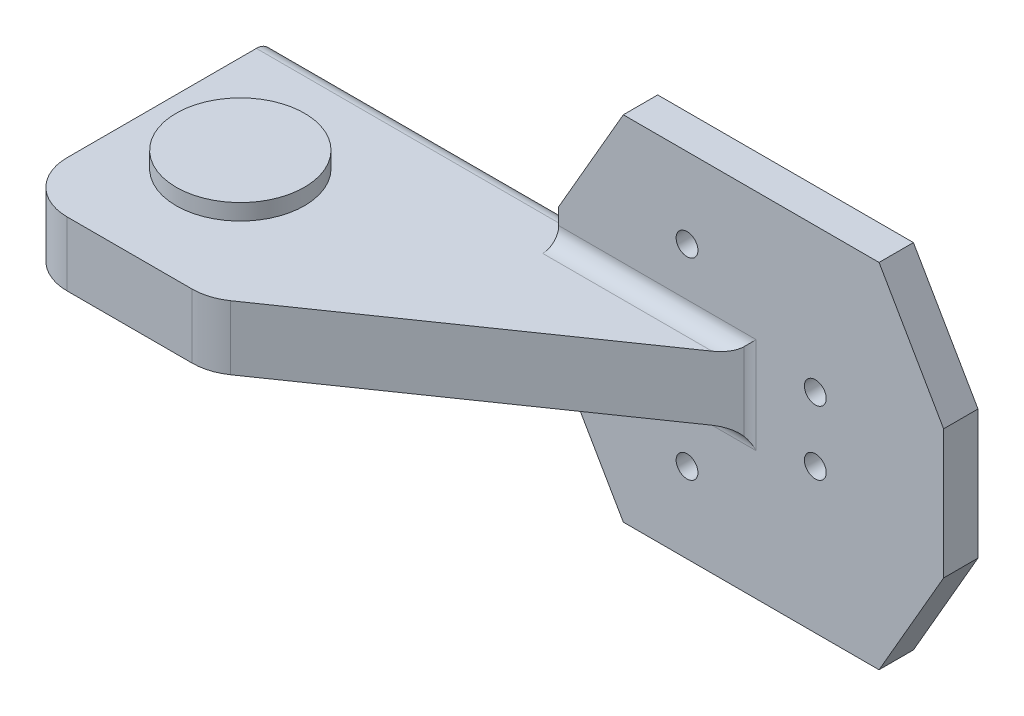
ISO-10303-21;
HEADER;
FILE_DESCRIPTION(('STEP AP214'),'2;1');
FILE_NAME('part.step','',(''),(''),'','','');
FILE_SCHEMA(('AUTOMOTIVE_DESIGN { 1 0 10303 214 1 1 1 1 }'));
ENDSEC;
DATA;
#1=APPLICATION_CONTEXT('core data for automotive mechanical design processes');
#2=APPLICATION_PROTOCOL_DEFINITION('international standard','automotive_design',2000,#1);
#3=PRODUCT_CONTEXT('',#1,'mechanical');
#4=PRODUCT('Part','Part','',(#3));
#5=PRODUCT_RELATED_PRODUCT_CATEGORY('part','',(#4));
#6=PRODUCT_DEFINITION_FORMATION('','',#4);
#7=PRODUCT_DEFINITION_CONTEXT('part definition',#1,'design');
#8=PRODUCT_DEFINITION('design','',#6,#7);
#9=PRODUCT_DEFINITION_SHAPE('','',#8);
#10=(LENGTH_UNIT() NAMED_UNIT(*) SI_UNIT(.MILLI.,.METRE.));
#11=(NAMED_UNIT(*) PLANE_ANGLE_UNIT() SI_UNIT($,.RADIAN.));
#12=(NAMED_UNIT(*) SI_UNIT($,.STERADIAN.) SOLID_ANGLE_UNIT());
#13=UNCERTAINTY_MEASURE_WITH_UNIT(LENGTH_MEASURE(1.E-05),#10,'distance_accuracy_value','');
#14=(GEOMETRIC_REPRESENTATION_CONTEXT(3) GLOBAL_UNCERTAINTY_ASSIGNED_CONTEXT((#13)) GLOBAL_UNIT_ASSIGNED_CONTEXT((#10,
#11,#12)) REPRESENTATION_CONTEXT('',''));
#15=CARTESIAN_POINT('',(0.,0.,0.));
#16=DIRECTION('',(0.,0.,1.));
#17=DIRECTION('',(1.,0.,0.));
#18=AXIS2_PLACEMENT_3D('',#15,#16,#17);
#19=CARTESIAN_POINT('',(0.,12.7,-25.4));
#20=DIRECTION('',(0.,0.,1.));
#21=DIRECTION('',(1.,0.,0.));
#22=AXIS2_PLACEMENT_3D('',#19,#20,#21);
#23=PLANE('',#22);
#24=CARTESIAN_POINT('',(114.3,12.7,-25.4));
#25=DIRECTION('',(0.,0.,-1.));
#26=DIRECTION('',(-1.,0.,0.));
#27=AXIS2_PLACEMENT_3D('',#24,#25,#26);
#28=CIRCLE('',#27,2.15899999999999);
#29=CARTESIAN_POINT('',(112.141,12.7,-25.4));
#30=VERTEX_POINT('',#29);
#31=EDGE_CURVE('E471',#30,#30,#28,.T.);
#32=ORIENTED_EDGE('',*,*,#31,.F.);
#33=EDGE_LOOP('',(#32));
#34=FACE_BOUND('',#33,.T.);
#35=DIRECTION('',(0.,-1.,0.));
#36=VECTOR('',#35,1.);
#37=CARTESIAN_POINT('',(63.5,19.1334372271715,-25.4));
#38=LINE('',#37,#36);
#39=CARTESIAN_POINT('',(63.5,3.175,-25.4));
#40=VERTEX_POINT('',#39);
#41=CARTESIAN_POINT('',(63.5,-6.43343722717151,-25.4));
#42=VERTEX_POINT('',#41);
#43=EDGE_CURVE('E332',#40,#42,#38,.T.);
#44=ORIENTED_EDGE('',*,*,#43,.F.);
#45=DIRECTION('',(-1.,0.,0.));
#46=VECTOR('',#45,1.);
#47=CARTESIAN_POINT('',(0.,3.175,-25.4));
#48=LINE('',#47,#46);
#49=CARTESIAN_POINT('',(0.,3.175,-25.4));
#50=VERTEX_POINT('',#49);
#51=EDGE_CURVE('E267',#40,#50,#48,.T.);
#52=ORIENTED_EDGE('',*,*,#51,.T.);
#53=DIRECTION('',(0.,-1.,0.));
#54=VECTOR('',#53,1.);
#55=CARTESIAN_POINT('',(0.,12.7,-25.4));
#56=LINE('',#55,#54);
#57=CARTESIAN_POINT('',(0.,9.525,-25.4));
#58=VERTEX_POINT('',#57);
#59=EDGE_CURVE('E227',#58,#50,#56,.T.);
#60=ORIENTED_EDGE('',*,*,#59,.F.);
#61=DIRECTION('',(-1.,0.,0.));
#62=VECTOR('',#61,1.);
#63=CARTESIAN_POINT('',(63.5,9.525,-25.4));
#64=LINE('',#63,#62);
#65=CARTESIAN_POINT('',(63.5,9.525,-25.4));
#66=VERTEX_POINT('',#65);
#67=EDGE_CURVE('E264',#58,#66,#64,.F.);
#68=ORIENTED_EDGE('',*,*,#67,.T.);
#69=CARTESIAN_POINT('',(63.5,19.1334372271715,-25.4));
#70=VERTEX_POINT('',#69);
#71=EDGE_CURVE('E336',#70,#66,#38,.T.);
#72=ORIENTED_EDGE('',*,*,#71,.F.);
#73=DIRECTION('',(0.499999999999997,0.86602540378444,0.));
#74=VECTOR('',#73,1.);
#75=CARTESIAN_POINT('',(63.5,19.1334372271715,-25.4));
#76=LINE('',#75,#74);
#77=CARTESIAN_POINT('',(76.2834372271714,41.275,-25.4));
#78=VERTEX_POINT('',#77);
#79=EDGE_CURVE('E337',#70,#78,#76,.T.);
#80=ORIENTED_EDGE('',*,*,#79,.T.);
#81=DIRECTION('',(1.,0.,0.));
#82=VECTOR('',#81,1.);
#83=CARTESIAN_POINT('',(76.2834372271714,41.275,-25.4));
#84=LINE('',#83,#82);
#85=CARTESIAN_POINT('',(126.916562772829,41.275,-25.4));
#86=VERTEX_POINT('',#85);
#87=EDGE_CURVE('E432',#78,#86,#84,.T.);
#88=ORIENTED_EDGE('',*,*,#87,.T.);
#89=DIRECTION('',(0.499999999999997,-0.86602540378444,0.));
#90=VECTOR('',#89,1.);
#91=CARTESIAN_POINT('',(126.916562772829,41.275,-25.4));
#92=LINE('',#91,#90);
#93=CARTESIAN_POINT('',(139.7,19.1334372271715,-25.4));
#94=VERTEX_POINT('',#93);
#95=EDGE_CURVE('E429',#86,#94,#92,.T.);
#96=ORIENTED_EDGE('',*,*,#95,.T.);
#97=DIRECTION('',(0.,1.,0.));
#98=VECTOR('',#97,1.);
#99=CARTESIAN_POINT('',(139.7,-6.43343722717151,-25.4));
#100=LINE('',#99,#98);
#101=CARTESIAN_POINT('',(139.7,-6.43343722717151,-25.4));
#102=VERTEX_POINT('',#101);
#103=EDGE_CURVE('E426',#102,#94,#100,.T.);
#104=ORIENTED_EDGE('',*,*,#103,.F.);
#105=DIRECTION('',(0.499999999999997,0.86602540378444,0.));
#106=VECTOR('',#105,1.);
#107=CARTESIAN_POINT('',(126.916562772829,-28.575,-25.4));
#108=LINE('',#107,#106);
#109=CARTESIAN_POINT('',(126.916562772829,-28.575,-25.4));
#110=VERTEX_POINT('',#109);
#111=EDGE_CURVE('E424',#110,#102,#108,.T.);
#112=ORIENTED_EDGE('',*,*,#111,.F.);
#113=DIRECTION('',(1.,0.,0.));
#114=VECTOR('',#113,1.);
#115=CARTESIAN_POINT('',(76.2834372271714,-28.575,-25.4));
#116=LINE('',#115,#114);
#117=CARTESIAN_POINT('',(76.2834372271714,-28.575,-25.4));
#118=VERTEX_POINT('',#117);
#119=EDGE_CURVE('E210',#118,#110,#116,.T.);
#120=ORIENTED_EDGE('',*,*,#119,.F.);
#121=DIRECTION('',(0.499999999999997,-0.86602540378444,0.));
#122=VECTOR('',#121,1.);
#123=CARTESIAN_POINT('',(63.5,-6.43343722717151,-25.4));
#124=LINE('',#123,#122);
#125=EDGE_CURVE('E206',#42,#118,#124,.T.);
#126=ORIENTED_EDGE('',*,*,#125,.F.);
#127=EDGE_LOOP('',(#44,#52,#60,#68,#72,#80,#88,#96,#104,#112,#120,#126));
#128=FACE_BOUND('',#127,.T.);
#129=CARTESIAN_POINT('',(88.9,-12.7,-25.4));
#130=DIRECTION('',(0.,0.,-1.));
#131=DIRECTION('',(-1.,0.,0.));
#132=AXIS2_PLACEMENT_3D('',#129,#130,#131);
#133=CIRCLE('',#132,2.15899999999999);
#134=CARTESIAN_POINT('',(86.741,-12.7,-25.4));
#135=VERTEX_POINT('',#134);
#136=EDGE_CURVE('E465',#135,#135,#133,.F.);
#137=ORIENTED_EDGE('',*,*,#136,.T.);
#138=EDGE_LOOP('',(#137));
#139=FACE_BOUND('',#138,.T.);
#140=CARTESIAN_POINT('',(88.9,25.4,-25.4));
#141=DIRECTION('',(0.,0.,-1.));
#142=DIRECTION('',(-1.,0.,0.));
#143=AXIS2_PLACEMENT_3D('',#140,#141,#142);
#144=CIRCLE('',#143,2.15899999999999);
#145=CARTESIAN_POINT('',(86.741,25.4,-25.4));
#146=VERTEX_POINT('',#145);
#147=EDGE_CURVE('E243',#146,#146,#144,.T.);
#148=ORIENTED_EDGE('',*,*,#147,.F.);
#149=EDGE_LOOP('',(#148));
#150=FACE_BOUND('',#149,.T.);
#151=CARTESIAN_POINT('',(114.3,0.,-25.4));
#152=DIRECTION('',(0.,0.,-1.));
#153=DIRECTION('',(-1.,0.,0.));
#154=AXIS2_PLACEMENT_3D('',#151,#152,#153);
#155=CIRCLE('',#154,2.15899999999999);
#156=CARTESIAN_POINT('',(112.141,0.,-25.4));
#157=VERTEX_POINT('',#156);
#158=EDGE_CURVE('E474',#157,#157,#155,.F.);
#159=ORIENTED_EDGE('',*,*,#158,.T.);
#160=EDGE_LOOP('',(#159));
#161=FACE_BOUND('',#160,.T.);
#162=ADVANCED_FACE('F39',(#34,#128,#139,#150,#161),#23,.F.);
#163=CARTESIAN_POINT('',(0.,0.,-18.5940905122489));
#164=DIRECTION('',(0.,0.,1.));
#165=DIRECTION('',(1.,0.,0.));
#166=AXIS2_PLACEMENT_3D('',#163,#164,#165);
#167=PLANE('',#166);
#168=CARTESIAN_POINT('',(88.9,25.4,-18.5940905122489));
#169=DIRECTION('',(0.,0.,1.));
#170=DIRECTION('',(1.,0.,0.));
#171=AXIS2_PLACEMENT_3D('',#168,#169,#170);
#172=CIRCLE('',#171,2.15899999999999);
#173=CARTESIAN_POINT('',(91.059,25.4,-18.5940905122489));
#174=VERTEX_POINT('',#173);
#175=EDGE_CURVE('E242',#174,#174,#172,.T.);
#176=ORIENTED_EDGE('',*,*,#175,.F.);
#177=EDGE_LOOP('',(#176));
#178=FACE_BOUND('',#177,.T.);
#179=DIRECTION('',(0.,-1.,0.));
#180=VECTOR('',#179,1.);
#181=CARTESIAN_POINT('',(102.592399015859,0.,-18.5940905122489));
#182=LINE('',#181,#180);
#183=CARTESIAN_POINT('',(102.592399015859,15.875,-18.5940905122489));
#184=VERTEX_POINT('',#183);
#185=CARTESIAN_POINT('',(102.592399015859,-3.175,-18.5940905122489));
#186=VERTEX_POINT('',#185);
#187=EDGE_CURVE('E252',#184,#186,#182,.T.);
#188=ORIENTED_EDGE('',*,*,#187,.T.);
#189=DIRECTION('',(1.,0.,0.));
#190=VECTOR('',#189,1.);
#191=CARTESIAN_POINT('',(0.,-3.175,-18.5940905122489));
#192=LINE('',#191,#190);
#193=CARTESIAN_POINT('',(63.5,-3.175,-18.5940905122489));
#194=VERTEX_POINT('',#193);
#195=EDGE_CURVE('E254',#186,#194,#192,.F.);
#196=ORIENTED_EDGE('',*,*,#195,.T.);
#197=DIRECTION('',(0.,-1.,0.));
#198=VECTOR('',#197,1.);
#199=CARTESIAN_POINT('',(63.5,19.1334372271715,-18.5940905122489));
#200=LINE('',#199,#198);
#201=CARTESIAN_POINT('',(63.5,-6.43343722717151,-18.5940905122489));
#202=VERTEX_POINT('',#201);
#203=EDGE_CURVE('E416',#194,#202,#200,.T.);
#204=ORIENTED_EDGE('',*,*,#203,.T.);
#205=DIRECTION('',(0.499999999999997,-0.86602540378444,0.));
#206=VECTOR('',#205,1.);
#207=CARTESIAN_POINT('',(63.5,-6.43343722717151,-18.5940905122489));
#208=LINE('',#207,#206);
#209=CARTESIAN_POINT('',(76.2834372271714,-28.575,-18.5940905122489));
#210=VERTEX_POINT('',#209);
#211=EDGE_CURVE('E202',#202,#210,#208,.T.);
#212=ORIENTED_EDGE('',*,*,#211,.T.);
#213=DIRECTION('',(1.,0.,0.));
#214=VECTOR('',#213,1.);
#215=CARTESIAN_POINT('',(76.2834372271714,-28.575,-18.5940905122489));
#216=LINE('',#215,#214);
#217=CARTESIAN_POINT('',(126.916562772829,-28.575,-18.5940905122489));
#218=VERTEX_POINT('',#217);
#219=EDGE_CURVE('E196',#210,#218,#216,.T.);
#220=ORIENTED_EDGE('',*,*,#219,.T.);
#221=DIRECTION('',(0.499999999999997,0.86602540378444,0.));
#222=VECTOR('',#221,1.);
#223=CARTESIAN_POINT('',(126.916562772829,-28.575,-18.5940905122489));
#224=LINE('',#223,#222);
#225=CARTESIAN_POINT('',(139.7,-6.43343722717151,-18.5940905122489));
#226=VERTEX_POINT('',#225);
#227=EDGE_CURVE('E185',#218,#226,#224,.T.);
#228=ORIENTED_EDGE('',*,*,#227,.T.);
#229=DIRECTION('',(0.,1.,0.));
#230=VECTOR('',#229,1.);
#231=CARTESIAN_POINT('',(139.7,-6.43343722717151,-18.5940905122489));
#232=LINE('',#231,#230);
#233=CARTESIAN_POINT('',(139.7,19.1334372271715,-18.5940905122489));
#234=VERTEX_POINT('',#233);
#235=EDGE_CURVE('E195',#226,#234,#232,.T.);
#236=ORIENTED_EDGE('',*,*,#235,.T.);
#237=DIRECTION('',(0.499999999999997,-0.86602540378444,0.));
#238=VECTOR('',#237,1.);
#239=CARTESIAN_POINT('',(126.916562772829,41.275,-18.5940905122489));
#240=LINE('',#239,#238);
#241=CARTESIAN_POINT('',(126.916562772829,41.275,-18.5940905122489));
#242=VERTEX_POINT('',#241);
#243=EDGE_CURVE('E452',#242,#234,#240,.T.);
#244=ORIENTED_EDGE('',*,*,#243,.F.);
#245=DIRECTION('',(1.,0.,0.));
#246=VECTOR('',#245,1.);
#247=CARTESIAN_POINT('',(76.2834372271714,41.275,-18.5940905122489));
#248=LINE('',#247,#246);
#249=CARTESIAN_POINT('',(76.2834372271714,41.275,-18.5940905122489));
#250=VERTEX_POINT('',#249);
#251=EDGE_CURVE('E461',#250,#242,#248,.T.);
#252=ORIENTED_EDGE('',*,*,#251,.F.);
#253=DIRECTION('',(0.499999999999997,0.86602540378444,0.));
#254=VECTOR('',#253,1.);
#255=CARTESIAN_POINT('',(63.5,19.1334372271715,-18.5940905122489));
#256=LINE('',#255,#254);
#257=CARTESIAN_POINT('',(63.5,19.1334372271715,-18.5940905122489));
#258=VERTEX_POINT('',#257);
#259=EDGE_CURVE('E415',#258,#250,#256,.T.);
#260=ORIENTED_EDGE('',*,*,#259,.F.);
#261=CARTESIAN_POINT('',(63.5,15.875,-18.5940905122489));
#262=VERTEX_POINT('',#261);
#263=EDGE_CURVE('E411',#258,#262,#200,.T.);
#264=ORIENTED_EDGE('',*,*,#263,.T.);
#265=DIRECTION('',(1.,0.,0.));
#266=VECTOR('',#265,1.);
#267=CARTESIAN_POINT('',(101.6,15.875,-18.5940905122489));
#268=LINE('',#267,#266);
#269=EDGE_CURVE('E250',#262,#184,#268,.T.);
#270=ORIENTED_EDGE('',*,*,#269,.T.);
#271=EDGE_LOOP('',(#188,#196,#204,#212,#220,#228,#236,#244,#252,#260,#264,#270));
#272=FACE_BOUND('',#271,.T.);
#273=CARTESIAN_POINT('',(88.9,-12.7,-18.5940905122489));
#274=DIRECTION('',(0.,0.,1.));
#275=DIRECTION('',(1.,0.,0.));
#276=AXIS2_PLACEMENT_3D('',#273,#274,#275);
#277=CIRCLE('',#276,2.15899999999999);
#278=CARTESIAN_POINT('',(91.059,-12.7,-18.5940905122489));
#279=VERTEX_POINT('',#278);
#280=EDGE_CURVE('E239',#279,#279,#277,.F.);
#281=ORIENTED_EDGE('',*,*,#280,.T.);
#282=EDGE_LOOP('',(#281));
#283=FACE_BOUND('',#282,.T.);
#284=CARTESIAN_POINT('',(114.3,12.7,-18.5940905122489));
#285=DIRECTION('',(0.,0.,1.));
#286=DIRECTION('',(1.,0.,0.));
#287=AXIS2_PLACEMENT_3D('',#284,#285,#286);
#288=CIRCLE('',#287,2.15899999999999);
#289=CARTESIAN_POINT('',(112.141,12.7,-18.5940905122489));
#290=VERTEX_POINT('',#289);
#291=EDGE_CURVE('E298',#290,#290,#288,.F.);
#292=ORIENTED_EDGE('',*,*,#291,.T.);
#293=EDGE_LOOP('',(#292));
#294=FACE_BOUND('',#293,.T.);
#295=CARTESIAN_POINT('',(114.3,0.,-18.5940905122489));
#296=DIRECTION('',(0.,0.,1.));
#297=DIRECTION('',(1.,0.,0.));
#298=AXIS2_PLACEMENT_3D('',#295,#296,#297);
#299=CIRCLE('',#298,2.15899999999999);
#300=CARTESIAN_POINT('',(112.141,0.,-18.5940905122489));
#301=VERTEX_POINT('',#300);
#302=EDGE_CURVE('E468',#301,#301,#299,.T.);
#303=ORIENTED_EDGE('',*,*,#302,.F.);
#304=EDGE_LOOP('',(#303));
#305=FACE_BOUND('',#304,.T.);
#306=ADVANCED_FACE('F199',(#178,#272,#283,#294,#305),#167,.T.);
#307=CARTESIAN_POINT('',(0.,12.7,0.));
#308=DIRECTION('',(0.,1.,0.));
#309=DIRECTION('',(0.,0.,1.));
#310=AXIS2_PLACEMENT_3D('',#307,#308,#309);
#311=PLANE('',#310);
#312=CARTESIAN_POINT('',(19.05,12.7,0.));
#313=DIRECTION('',(0.,1.,0.));
#314=DIRECTION('',(0.,0.,1.));
#315=AXIS2_PLACEMENT_3D('',#312,#313,#314);
#316=CIRCLE('',#315,12.7);
#317=CARTESIAN_POINT('',(19.05,12.7,12.7));
#318=VERTEX_POINT('',#317);
#319=EDGE_CURVE('E481',#318,#318,#316,.T.);
#320=ORIENTED_EDGE('',*,*,#319,.F.);
#321=EDGE_LOOP('',(#320));
#322=FACE_BOUND('',#321,.T.);
#323=DIRECTION('',(0.,0.,1.));
#324=VECTOR('',#323,1.);
#325=CARTESIAN_POINT('',(0.,12.7,-25.4));
#326=LINE('',#325,#324);
#327=CARTESIAN_POINT('',(0.,12.7,-22.225));
#328=VERTEX_POINT('',#327);
#329=CARTESIAN_POINT('',(0.,12.7,15.24));
#330=VERTEX_POINT('',#329);
#331=EDGE_CURVE('E220',#328,#330,#326,.T.);
#332=ORIENTED_EDGE('',*,*,#331,.T.);
#333=CARTESIAN_POINT('',(10.16,12.7,15.24));
#334=DIRECTION('',(0.,1.,0.));
#335=DIRECTION('',(0.,0.,1.));
#336=AXIS2_PLACEMENT_3D('',#333,#334,#335);
#337=CIRCLE('',#336,10.16);
#338=CARTESIAN_POINT('',(10.16,12.7,25.4));
#339=VERTEX_POINT('',#338);
#340=EDGE_CURVE('E47',#330,#339,#337,.T.);
#341=ORIENTED_EDGE('',*,*,#340,.T.);
#342=DIRECTION('',(1.,0.,0.));
#343=VECTOR('',#342,1.);
#344=CARTESIAN_POINT('',(0.,12.7,25.4));
#345=LINE('',#344,#343);
#346=CARTESIAN_POINT('',(34.9243231492526,12.7,25.4));
#347=VERTEX_POINT('',#346);
#348=EDGE_CURVE('E222',#339,#347,#345,.T.);
#349=ORIENTED_EDGE('',*,*,#348,.T.);
#350=CARTESIAN_POINT('',(34.9243231492526,12.7,15.24));
#351=DIRECTION('',(0.,1.,0.));
#352=DIRECTION('',(0.,0.,1.));
#353=AXIS2_PLACEMENT_3D('',#350,#351,#352);
#354=CIRCLE('',#353,10.16);
#355=CARTESIAN_POINT('',(40.7103902913597,12.7,23.5914685551122));
#356=VERTEX_POINT('',#355);
#357=EDGE_CURVE('E54',#347,#356,#354,.T.);
#358=ORIENTED_EDGE('',*,*,#357,.T.);
#359=DIRECTION('',(0.82199493652679,0.,-0.569494797451494));
#360=VECTOR('',#359,1.);
#361=CARTESIAN_POINT('',(101.6,12.7,-18.5940905122489));
#362=LINE('',#361,#360);
#363=CARTESIAN_POINT('',(97.0172822383073,12.7,-15.4190905122489));
#364=VERTEX_POINT('',#363);
#365=EDGE_CURVE('E225',#356,#364,#362,.T.);
#366=ORIENTED_EDGE('',*,*,#365,.T.);
#367=DIRECTION('',(1.,0.,0.));
#368=VECTOR('',#367,1.);
#369=CARTESIAN_POINT('',(63.5,12.7,-15.4190905122489));
#370=LINE('',#369,#368);
#371=CARTESIAN_POINT('',(63.5,12.7,-15.4190905122489));
#372=VERTEX_POINT('',#371);
#373=EDGE_CURVE('E261',#364,#372,#370,.F.);
#374=ORIENTED_EDGE('',*,*,#373,.T.);
#375=DIRECTION('',(0.,0.,-1.));
#376=VECTOR('',#375,1.);
#377=CARTESIAN_POINT('',(63.5,12.7,0.));
#378=LINE('',#377,#376);
#379=CARTESIAN_POINT('',(63.5,12.7,-22.225));
#380=VERTEX_POINT('',#379);
#381=EDGE_CURVE('E211',#372,#380,#378,.T.);
#382=ORIENTED_EDGE('',*,*,#381,.T.);
#383=DIRECTION('',(-1.,0.,0.));
#384=VECTOR('',#383,1.);
#385=CARTESIAN_POINT('',(0.,12.7,-22.225));
#386=LINE('',#385,#384);
#387=EDGE_CURVE('E258',#380,#328,#386,.T.);
#388=ORIENTED_EDGE('',*,*,#387,.T.);
#389=EDGE_LOOP('',(#332,#341,#349,#358,#366,#374,#382,#388));
#390=FACE_BOUND('',#389,.T.);
#391=ADVANCED_FACE('F310',(#322,#390),#311,.T.);
#392=CARTESIAN_POINT('',(0.,0.,0.));
#393=DIRECTION('',(0.,1.,0.));
#394=DIRECTION('',(0.,0.,1.));
#395=AXIS2_PLACEMENT_3D('',#392,#393,#394);
#396=PLANE('',#395);
#397=DIRECTION('',(1.,0.,0.));
#398=VECTOR('',#397,1.);
#399=CARTESIAN_POINT('',(0.,0.,25.4));
#400=LINE('',#399,#398);
#401=CARTESIAN_POINT('',(10.16,0.,25.4));
#402=VERTEX_POINT('',#401);
#403=CARTESIAN_POINT('',(34.9243231492526,0.,25.4));
#404=VERTEX_POINT('',#403);
#405=EDGE_CURVE('E229',#402,#404,#400,.T.);
#406=ORIENTED_EDGE('',*,*,#405,.F.);
#407=CARTESIAN_POINT('',(10.16,0.,15.24));
#408=DIRECTION('',(0.,1.,0.));
#409=DIRECTION('',(0.,0.,1.));
#410=AXIS2_PLACEMENT_3D('',#407,#408,#409);
#411=CIRCLE('',#410,10.16);
#412=CARTESIAN_POINT('',(0.,0.,15.24));
#413=VERTEX_POINT('',#412);
#414=EDGE_CURVE('E305',#402,#413,#411,.F.);
#415=ORIENTED_EDGE('',*,*,#414,.T.);
#416=DIRECTION('',(0.,0.,1.));
#417=VECTOR('',#416,1.);
#418=CARTESIAN_POINT('',(0.,0.,-25.4));
#419=LINE('',#418,#417);
#420=CARTESIAN_POINT('',(0.,0.,-22.225));
#421=VERTEX_POINT('',#420);
#422=EDGE_CURVE('E214',#421,#413,#419,.T.);
#423=ORIENTED_EDGE('',*,*,#422,.F.);
#424=DIRECTION('',(-1.,0.,0.));
#425=VECTOR('',#424,1.);
#426=CARTESIAN_POINT('',(0.,0.,-22.225));
#427=LINE('',#426,#425);
#428=CARTESIAN_POINT('',(63.5,0.,-22.225));
#429=VERTEX_POINT('',#428);
#430=EDGE_CURVE('E238',#421,#429,#427,.F.);
#431=ORIENTED_EDGE('',*,*,#430,.T.);
#432=DIRECTION('',(0.,0.,-1.));
#433=VECTOR('',#432,1.);
#434=CARTESIAN_POINT('',(63.5,0.,0.));
#435=LINE('',#434,#433);
#436=CARTESIAN_POINT('',(63.5,0.,-15.4190905122489));
#437=VERTEX_POINT('',#436);
#438=EDGE_CURVE('E235',#437,#429,#435,.T.);
#439=ORIENTED_EDGE('',*,*,#438,.F.);
#440=DIRECTION('',(1.,0.,0.));
#441=VECTOR('',#440,1.);
#442=CARTESIAN_POINT('',(0.,0.,-15.4190905122489));
#443=LINE('',#442,#441);
#444=CARTESIAN_POINT('',(97.0172822383073,0.,-15.4190905122489));
#445=VERTEX_POINT('',#444);
#446=EDGE_CURVE('E247',#437,#445,#443,.T.);
#447=ORIENTED_EDGE('',*,*,#446,.T.);
#448=DIRECTION('',(0.82199493652679,0.,-0.569494797451494));
#449=VECTOR('',#448,1.);
#450=CARTESIAN_POINT('',(101.6,0.,-18.5940905122489));
#451=LINE('',#450,#449);
#452=CARTESIAN_POINT('',(40.7103902913597,0.,23.5914685551122));
#453=VERTEX_POINT('',#452);
#454=EDGE_CURVE('E223',#453,#445,#451,.T.);
#455=ORIENTED_EDGE('',*,*,#454,.F.);
#456=CARTESIAN_POINT('',(34.9243231492526,0.,15.24));
#457=DIRECTION('',(0.,1.,0.));
#458=DIRECTION('',(0.,0.,1.));
#459=AXIS2_PLACEMENT_3D('',#456,#457,#458);
#460=CIRCLE('',#459,10.16);
#461=EDGE_CURVE('E303',#453,#404,#460,.F.);
#462=ORIENTED_EDGE('',*,*,#461,.T.);
#463=EDGE_LOOP('',(#406,#415,#423,#431,#439,#447,#455,#462));
#464=FACE_BOUND('',#463,.T.);
#465=ADVANCED_FACE('F320',(#464),#396,.F.);
#466=CARTESIAN_POINT('',(0.,12.7,-25.4));
#467=DIRECTION('',(1.,0.,0.));
#468=DIRECTION('',(0.,0.,-1.));
#469=AXIS2_PLACEMENT_3D('',#466,#467,#468);
#470=PLANE('',#469);
#471=ORIENTED_EDGE('',*,*,#422,.T.);
#472=DIRECTION('',(0.,-1.,0.));
#473=VECTOR('',#472,1.);
#474=CARTESIAN_POINT('',(0.,12.7,15.24));
#475=LINE('',#474,#473);
#476=EDGE_CURVE('E62',#413,#330,#475,.F.);
#477=ORIENTED_EDGE('',*,*,#476,.T.);
#478=ORIENTED_EDGE('',*,*,#331,.F.);
#479=CARTESIAN_POINT('',(0.,9.525,-22.225));
#480=DIRECTION('',(1.,0.,0.));
#481=DIRECTION('',(0.,0.,-1.));
#482=AXIS2_PLACEMENT_3D('',#479,#480,#481);
#483=CIRCLE('',#482,3.175);
#484=EDGE_CURVE('E270',#328,#58,#483,.F.);
#485=ORIENTED_EDGE('',*,*,#484,.T.);
#486=ORIENTED_EDGE('',*,*,#59,.T.);
#487=CARTESIAN_POINT('',(0.,3.175,-22.225));
#488=DIRECTION('',(1.,0.,0.));
#489=DIRECTION('',(0.,0.,-1.));
#490=AXIS2_PLACEMENT_3D('',#487,#488,#489);
#491=CIRCLE('',#490,3.175);
#492=EDGE_CURVE('E272',#50,#421,#491,.F.);
#493=ORIENTED_EDGE('',*,*,#492,.T.);
#494=EDGE_LOOP('',(#471,#477,#478,#485,#486,#493));
#495=FACE_BOUND('',#494,.T.);
#496=ADVANCED_FACE('F322',(#495),#470,.F.);
#497=CARTESIAN_POINT('',(0.,12.7,25.4));
#498=DIRECTION('',(0.,0.,-1.));
#499=DIRECTION('',(-1.,0.,0.));
#500=AXIS2_PLACEMENT_3D('',#497,#498,#499);
#501=PLANE('',#500);
#502=ORIENTED_EDGE('',*,*,#348,.F.);
#503=DIRECTION('',(0.,-1.,0.));
#504=VECTOR('',#503,1.);
#505=CARTESIAN_POINT('',(10.16,12.7,25.4));
#506=LINE('',#505,#504);
#507=EDGE_CURVE('E300',#339,#402,#506,.T.);
#508=ORIENTED_EDGE('',*,*,#507,.T.);
#509=ORIENTED_EDGE('',*,*,#405,.T.);
#510=DIRECTION('',(0.,-1.,0.));
#511=VECTOR('',#510,1.);
#512=CARTESIAN_POINT('',(34.9243231492526,12.7,25.4));
#513=LINE('',#512,#511);
#514=EDGE_CURVE('E290',#404,#347,#513,.F.);
#515=ORIENTED_EDGE('',*,*,#514,.T.);
#516=EDGE_LOOP('',(#502,#508,#509,#515));
#517=FACE_BOUND('',#516,.T.);
#518=ADVANCED_FACE('F314',(#517),#501,.F.);
#519=CARTESIAN_POINT('',(101.6,12.7,-18.5940905122489));
#520=DIRECTION('',(-0.569494797451494,0.,-0.82199493652679));
#521=DIRECTION('',(-0.82199493652679,0.,0.569494797451494));
#522=AXIS2_PLACEMENT_3D('',#519,#520,#521);
#523=PLANE('',#522);
#524=ORIENTED_EDGE('',*,*,#365,.F.);
#525=DIRECTION('',(0.,-1.,0.));
#526=VECTOR('',#525,1.);
#527=CARTESIAN_POINT('',(40.7103902913597,12.7,23.5914685551122));
#528=LINE('',#527,#526);
#529=EDGE_CURVE('E11',#356,#453,#528,.T.);
#530=ORIENTED_EDGE('',*,*,#529,.T.);
#531=ORIENTED_EDGE('',*,*,#454,.T.);
#532=CARTESIAN_POINT('',(97.0172822383073,-3.175,-15.4190905122489));
#533=DIRECTION('',(-0.569494797451494,0.,-0.82199493652679));
#534=DIRECTION('',(0.82199493652679,0.,-0.569494797451494));
#535=AXIS2_PLACEMENT_3D('',#532,#533,#534);
#536=ELLIPSE('',#535,5.57511677755129,3.175);
#537=CARTESIAN_POINT('',(100.78425303395,-1.36685401808967,-18.0289244357214));
#538=VERTEX_POINT('',#537);
#539=EDGE_CURVE('E274',#445,#538,#536,.T.);
#540=ORIENTED_EDGE('',*,*,#539,.T.);
#541=DIRECTION('',(0.,-1.,0.));
#542=VECTOR('',#541,1.);
#543=CARTESIAN_POINT('',(100.78425303395,12.7,-18.0289244357214));
#544=LINE('',#543,#542);
#545=CARTESIAN_POINT('',(100.78425303395,14.0668540180897,-18.0289244357214));
#546=VERTEX_POINT('',#545);
#547=EDGE_CURVE('E256',#538,#546,#544,.F.);
#548=ORIENTED_EDGE('',*,*,#547,.T.);
#549=CARTESIAN_POINT('',(97.0172822383073,15.875,-15.4190905122489));
#550=DIRECTION('',(-0.569494797451494,0.,-0.82199493652679));
#551=DIRECTION('',(-0.82199493652679,0.,0.569494797451494));
#552=AXIS2_PLACEMENT_3D('',#549,#550,#551);
#553=ELLIPSE('',#552,5.57511677755129,3.175);
#554=EDGE_CURVE('E280',#546,#364,#553,.T.);
#555=ORIENTED_EDGE('',*,*,#554,.T.);
#556=EDGE_LOOP('',(#524,#530,#531,#540,#548,#555));
#557=FACE_BOUND('',#556,.T.);
#558=ADVANCED_FACE('F350',(#557),#523,.F.);
#559=CARTESIAN_POINT('',(63.5,19.1334372271715,-18.5940905122489));
#560=DIRECTION('',(1.,0.,0.));
#561=DIRECTION('',(0.,0.,-1.));
#562=AXIS2_PLACEMENT_3D('',#559,#560,#561);
#563=PLANE('',#562);
#564=ORIENTED_EDGE('',*,*,#203,.F.);
#565=CARTESIAN_POINT('',(63.5,-3.175,-15.4190905122489));
#566=DIRECTION('',(1.,0.,0.));
#567=DIRECTION('',(0.,0.,-1.));
#568=AXIS2_PLACEMENT_3D('',#565,#566,#567);
#569=CIRCLE('',#568,3.175);
#570=EDGE_CURVE('E277',#194,#437,#569,.T.);
#571=ORIENTED_EDGE('',*,*,#570,.T.);
#572=ORIENTED_EDGE('',*,*,#438,.T.);
#573=CARTESIAN_POINT('',(63.5,3.175,-22.225));
#574=DIRECTION('',(1.,0.,0.));
#575=DIRECTION('',(0.,0.,-1.));
#576=AXIS2_PLACEMENT_3D('',#573,#574,#575);
#577=CIRCLE('',#576,3.175);
#578=EDGE_CURVE('E285',#429,#40,#577,.T.);
#579=ORIENTED_EDGE('',*,*,#578,.T.);
#580=ORIENTED_EDGE('',*,*,#43,.T.);
#581=DIRECTION('',(0.,0.,-1.));
#582=VECTOR('',#581,1.);
#583=CARTESIAN_POINT('',(63.5,-6.43343722717151,-18.5940905122489));
#584=LINE('',#583,#582);
#585=EDGE_CURVE('E439',#202,#42,#584,.T.);
#586=ORIENTED_EDGE('',*,*,#585,.F.);
#587=EDGE_LOOP('',(#564,#571,#572,#579,#580,#586));
#588=FACE_BOUND('',#587,.T.);
#589=ADVANCED_FACE('F340',(#588),#563,.F.);
#590=CARTESIAN_POINT('',(76.2834372271714,-28.575,-18.5940905122489));
#591=DIRECTION('',(0.,1.,0.));
#592=DIRECTION('',(0.,0.,1.));
#593=AXIS2_PLACEMENT_3D('',#590,#591,#592);
#594=PLANE('',#593);
#595=ORIENTED_EDGE('',*,*,#119,.T.);
#596=DIRECTION('',(0.,0.,-1.));
#597=VECTOR('',#596,1.);
#598=CARTESIAN_POINT('',(126.916562772829,-28.575,-18.5940905122489));
#599=LINE('',#598,#597);
#600=EDGE_CURVE('E189',#218,#110,#599,.T.);
#601=ORIENTED_EDGE('',*,*,#600,.F.);
#602=ORIENTED_EDGE('',*,*,#219,.F.);
#603=DIRECTION('',(0.,0.,-1.));
#604=VECTOR('',#603,1.);
#605=CARTESIAN_POINT('',(76.2834372271714,-28.575,-18.5940905122489));
#606=LINE('',#605,#604);
#607=EDGE_CURVE('E418',#210,#118,#606,.T.);
#608=ORIENTED_EDGE('',*,*,#607,.T.);
#609=EDGE_LOOP('',(#595,#601,#602,#608));
#610=FACE_BOUND('',#609,.T.);
#611=ADVANCED_FACE('F208',(#610),#594,.F.);
#612=CARTESIAN_POINT('',(126.916562772829,-28.575,-18.5940905122489));
#613=DIRECTION('',(-0.86602540378444,0.499999999999997,0.));
#614=DIRECTION('',(-0.499999999999997,-0.86602540378444,0.));
#615=AXIS2_PLACEMENT_3D('',#612,#613,#614);
#616=PLANE('',#615);
#617=ORIENTED_EDGE('',*,*,#111,.T.);
#618=DIRECTION('',(0.,0.,-1.));
#619=VECTOR('',#618,1.);
#620=CARTESIAN_POINT('',(139.7,-6.43343722717151,-18.5940905122489));
#621=LINE('',#620,#619);
#622=EDGE_CURVE('E192',#226,#102,#621,.T.);
#623=ORIENTED_EDGE('',*,*,#622,.F.);
#624=ORIENTED_EDGE('',*,*,#227,.F.);
#625=ORIENTED_EDGE('',*,*,#600,.T.);
#626=EDGE_LOOP('',(#617,#623,#624,#625));
#627=FACE_BOUND('',#626,.T.);
#628=ADVANCED_FACE('F187',(#627),#616,.F.);
#629=CARTESIAN_POINT('',(139.7,-6.43343722717151,-18.5940905122489));
#630=DIRECTION('',(-1.,0.,0.));
#631=DIRECTION('',(0.,0.,1.));
#632=AXIS2_PLACEMENT_3D('',#629,#630,#631);
#633=PLANE('',#632);
#634=ORIENTED_EDGE('',*,*,#103,.T.);
#635=DIRECTION('',(0.,0.,-1.));
#636=VECTOR('',#635,1.);
#637=CARTESIAN_POINT('',(139.7,19.1334372271715,-18.5940905122489));
#638=LINE('',#637,#636);
#639=EDGE_CURVE('E216',#234,#94,#638,.T.);
#640=ORIENTED_EDGE('',*,*,#639,.F.);
#641=ORIENTED_EDGE('',*,*,#235,.F.);
#642=ORIENTED_EDGE('',*,*,#622,.T.);
#643=EDGE_LOOP('',(#634,#640,#641,#642));
#644=FACE_BOUND('',#643,.T.);
#645=ADVANCED_FACE('F455',(#644),#633,.F.);
#646=CARTESIAN_POINT('',(126.916562772829,41.275,-18.5940905122489));
#647=DIRECTION('',(0.86602540378444,0.499999999999997,0.));
#648=DIRECTION('',(-0.499999999999997,0.86602540378444,0.));
#649=AXIS2_PLACEMENT_3D('',#646,#647,#648);
#650=PLANE('',#649);
#651=ORIENTED_EDGE('',*,*,#95,.F.);
#652=DIRECTION('',(0.,0.,-1.));
#653=VECTOR('',#652,1.);
#654=CARTESIAN_POINT('',(126.916562772829,41.275,-18.5940905122489));
#655=LINE('',#654,#653);
#656=EDGE_CURVE('E445',#242,#86,#655,.T.);
#657=ORIENTED_EDGE('',*,*,#656,.F.);
#658=ORIENTED_EDGE('',*,*,#243,.T.);
#659=ORIENTED_EDGE('',*,*,#639,.T.);
#660=EDGE_LOOP('',(#651,#657,#658,#659));
#661=FACE_BOUND('',#660,.T.);
#662=ADVANCED_FACE('F450',(#661),#650,.T.);
#663=CARTESIAN_POINT('',(76.2834372271714,41.275,-18.5940905122489));
#664=DIRECTION('',(0.,1.,0.));
#665=DIRECTION('',(-1.,0.,0.));
#666=AXIS2_PLACEMENT_3D('',#663,#664,#665);
#667=PLANE('',#666);
#668=ORIENTED_EDGE('',*,*,#87,.F.);
#669=DIRECTION('',(0.,0.,-1.));
#670=VECTOR('',#669,1.);
#671=CARTESIAN_POINT('',(76.2834372271714,41.275,-18.5940905122489));
#672=LINE('',#671,#670);
#673=EDGE_CURVE('E443',#250,#78,#672,.T.);
#674=ORIENTED_EDGE('',*,*,#673,.F.);
#675=ORIENTED_EDGE('',*,*,#251,.T.);
#676=ORIENTED_EDGE('',*,*,#656,.T.);
#677=EDGE_LOOP('',(#668,#674,#675,#676));
#678=FACE_BOUND('',#677,.T.);
#679=ADVANCED_FACE('F459',(#678),#667,.T.);
#680=CARTESIAN_POINT('',(63.5,19.1334372271715,-18.5940905122489));
#681=DIRECTION('',(-0.86602540378444,0.499999999999997,0.));
#682=DIRECTION('',(-0.499999999999997,-0.86602540378444,0.));
#683=AXIS2_PLACEMENT_3D('',#680,#681,#682);
#684=PLANE('',#683);
#685=ORIENTED_EDGE('',*,*,#79,.F.);
#686=DIRECTION('',(0.,0.,-1.));
#687=VECTOR('',#686,1.);
#688=CARTESIAN_POINT('',(63.5,19.1334372271715,-18.5940905122489));
#689=LINE('',#688,#687);
#690=EDGE_CURVE('E441',#258,#70,#689,.T.);
#691=ORIENTED_EDGE('',*,*,#690,.F.);
#692=ORIENTED_EDGE('',*,*,#259,.T.);
#693=ORIENTED_EDGE('',*,*,#673,.T.);
#694=EDGE_LOOP('',(#685,#691,#692,#693));
#695=FACE_BOUND('',#694,.T.);
#696=ADVANCED_FACE('F506',(#695),#684,.T.);
#697=ORIENTED_EDGE('',*,*,#381,.F.);
#698=CARTESIAN_POINT('',(63.5,15.875,-15.4190905122489));
#699=DIRECTION('',(1.,0.,0.));
#700=DIRECTION('',(0.,0.,-1.));
#701=AXIS2_PLACEMENT_3D('',#698,#699,#700);
#702=CIRCLE('',#701,3.175);
#703=EDGE_CURVE('E283',#372,#262,#702,.T.);
#704=ORIENTED_EDGE('',*,*,#703,.T.);
#705=ORIENTED_EDGE('',*,*,#263,.F.);
#706=ORIENTED_EDGE('',*,*,#690,.T.);
#707=ORIENTED_EDGE('',*,*,#71,.T.);
#708=CARTESIAN_POINT('',(63.5,9.525,-22.225));
#709=DIRECTION('',(1.,0.,0.));
#710=DIRECTION('',(0.,0.,-1.));
#711=AXIS2_PLACEMENT_3D('',#708,#709,#710);
#712=CIRCLE('',#711,3.175);
#713=EDGE_CURVE('E288',#66,#380,#712,.T.);
#714=ORIENTED_EDGE('',*,*,#713,.T.);
#715=EDGE_LOOP('',(#697,#704,#705,#706,#707,#714));
#716=FACE_BOUND('',#715,.T.);
#717=ADVANCED_FACE('F403',(#716),#563,.F.);
#718=CARTESIAN_POINT('',(63.5,-6.43343722717151,-18.5940905122489));
#719=DIRECTION('',(0.86602540378444,0.499999999999997,0.));
#720=DIRECTION('',(-0.499999999999997,0.86602540378444,0.));
#721=AXIS2_PLACEMENT_3D('',#718,#719,#720);
#722=PLANE('',#721);
#723=ORIENTED_EDGE('',*,*,#125,.T.);
#724=ORIENTED_EDGE('',*,*,#607,.F.);
#725=ORIENTED_EDGE('',*,*,#211,.F.);
#726=ORIENTED_EDGE('',*,*,#585,.T.);
#727=EDGE_LOOP('',(#723,#724,#725,#726));
#728=FACE_BOUND('',#727,.T.);
#729=ADVANCED_FACE('F512',(#728),#722,.F.);
#730=CARTESIAN_POINT('',(88.9,-12.7,25.4));
#731=DIRECTION('',(0.,0.,-1.));
#732=DIRECTION('',(-1.,0.,0.));
#733=AXIS2_PLACEMENT_3D('',#730,#731,#732);
#734=CYLINDRICAL_SURFACE('',#733,2.15899999999999);
#735=ORIENTED_EDGE('',*,*,#280,.F.);
#736=EDGE_LOOP('',(#735));
#737=FACE_BOUND('',#736,.T.);
#738=ORIENTED_EDGE('',*,*,#136,.F.);
#739=EDGE_LOOP('',(#738));
#740=FACE_BOUND('',#739,.T.);
#741=ADVANCED_FACE('F514',(#737,#740),#734,.F.);
#742=CARTESIAN_POINT('',(88.9,25.4,25.4));
#743=DIRECTION('',(0.,0.,-1.));
#744=DIRECTION('',(-1.,0.,0.));
#745=AXIS2_PLACEMENT_3D('',#742,#743,#744);
#746=CYLINDRICAL_SURFACE('',#745,2.15899999999999);
#747=ORIENTED_EDGE('',*,*,#175,.T.);
#748=EDGE_LOOP('',(#747));
#749=FACE_BOUND('',#748,.T.);
#750=ORIENTED_EDGE('',*,*,#147,.T.);
#751=EDGE_LOOP('',(#750));
#752=FACE_BOUND('',#751,.T.);
#753=ADVANCED_FACE('F519',(#749,#752),#746,.F.);
#754=CARTESIAN_POINT('',(114.3,12.7,-12.4875163499219));
#755=DIRECTION('',(0.,0.,-1.));
#756=DIRECTION('',(-1.,0.,0.));
#757=AXIS2_PLACEMENT_3D('',#754,#755,#756);
#758=CYLINDRICAL_SURFACE('',#757,2.15899999999999);
#759=CARTESIAN_POINT('',(112.141,12.7,-25.4));
#760=CARTESIAN_POINT('',(112.141,12.7,-25.3291051095026));
#761=CARTESIAN_POINT('',(112.141,12.7,-25.2582102190052));
#762=CARTESIAN_POINT('',(112.141,12.7,-25.1164204380104));
#763=CARTESIAN_POINT('',(112.141,12.7,-25.045525547513));
#764=CARTESIAN_POINT('',(112.141,12.7,-24.9037357665182));
#765=CARTESIAN_POINT('',(112.141,12.7,-24.8328408760208));
#766=CARTESIAN_POINT('',(112.141,12.7,-24.6910510950259));
#767=CARTESIAN_POINT('',(112.141,12.7,-24.6201562045285));
#768=CARTESIAN_POINT('',(112.141,12.7,-24.4783664235337));
#769=CARTESIAN_POINT('',(112.141,12.7,-24.4074715330363));
#770=CARTESIAN_POINT('',(112.141,12.7,-24.2656817520415));
#771=CARTESIAN_POINT('',(112.141,12.7,-24.1947868615441));
#772=CARTESIAN_POINT('',(112.141,12.7,-24.0529970805493));
#773=CARTESIAN_POINT('',(112.141,12.7,-23.9821021900519));
#774=CARTESIAN_POINT('',(112.141,12.7,-23.840312409057));
#775=CARTESIAN_POINT('',(112.141,12.7,-23.7694175185596));
#776=CARTESIAN_POINT('',(112.141,12.7,-23.6276277375648));
#777=CARTESIAN_POINT('',(112.141,12.7,-23.5567328470674));
#778=CARTESIAN_POINT('',(112.141,12.7,-23.4149430660726));
#779=CARTESIAN_POINT('',(112.141,12.7,-23.3440481755752));
#780=CARTESIAN_POINT('',(112.141,12.7,-23.2022583945804));
#781=CARTESIAN_POINT('',(112.141,12.7,-23.131363504083));
#782=CARTESIAN_POINT('',(112.141,12.7,-22.9895737230882));
#783=CARTESIAN_POINT('',(112.141,12.7,-22.9186788325908));
#784=CARTESIAN_POINT('',(112.141,12.7,-22.7768890515959));
#785=CARTESIAN_POINT('',(112.141,12.7,-22.7059941610985));
#786=CARTESIAN_POINT('',(112.141,12.7,-22.5642043801037));
#787=CARTESIAN_POINT('',(112.141,12.7,-22.4933094896063));
#788=CARTESIAN_POINT('',(112.141,12.7,-22.3515197086115));
#789=CARTESIAN_POINT('',(112.141,12.7,-22.2806248181141));
#790=CARTESIAN_POINT('',(112.141,12.7,-22.1388350371193));
#791=CARTESIAN_POINT('',(112.141,12.7,-22.0679401466219));
#792=CARTESIAN_POINT('',(112.141,12.7,-21.926150365627));
#793=CARTESIAN_POINT('',(112.141,12.7,-21.8552554751296));
#794=CARTESIAN_POINT('',(112.141,12.7,-21.7134656941348));
#795=CARTESIAN_POINT('',(112.141,12.7,-21.6425708036374));
#796=CARTESIAN_POINT('',(112.141,12.7,-21.5007810226426));
#797=CARTESIAN_POINT('',(112.141,12.7,-21.4298861321452));
#798=CARTESIAN_POINT('',(112.141,12.7,-21.2880963511504));
#799=CARTESIAN_POINT('',(112.141,12.7,-21.217201460653));
#800=CARTESIAN_POINT('',(112.141,12.7,-21.0754116796582));
#801=CARTESIAN_POINT('',(112.141,12.7,-21.0045167891607));
#802=CARTESIAN_POINT('',(112.141,12.7,-20.8627270081659));
#803=CARTESIAN_POINT('',(112.141,12.7,-20.7918321176685));
#804=CARTESIAN_POINT('',(112.141,12.7,-20.6500423366737));
#805=CARTESIAN_POINT('',(112.141,12.7,-20.5791474461763));
#806=CARTESIAN_POINT('',(112.141,12.7,-20.4373576651815));
#807=CARTESIAN_POINT('',(112.141,12.7,-20.3664627746841));
#808=CARTESIAN_POINT('',(112.141,12.7,-20.2246729936893));
#809=CARTESIAN_POINT('',(112.141,12.7,-20.1537781031919));
#810=CARTESIAN_POINT('',(112.141,12.7,-20.011988322197));
#811=CARTESIAN_POINT('',(112.141,12.7,-19.9410934316996));
#812=CARTESIAN_POINT('',(112.141,12.7,-19.7993036507048));
#813=CARTESIAN_POINT('',(112.141,12.7,-19.7284087602074));
#814=CARTESIAN_POINT('',(112.141,12.7,-19.5866189792126));
#815=CARTESIAN_POINT('',(112.141,12.7,-19.5157240887152));
#816=CARTESIAN_POINT('',(112.141,12.7,-19.3739343077204));
#817=CARTESIAN_POINT('',(112.141,12.7,-19.303039417223));
#818=CARTESIAN_POINT('',(112.141,12.7,-19.1612496362281));
#819=CARTESIAN_POINT('',(112.141,12.7,-19.0903547457307));
#820=CARTESIAN_POINT('',(112.141,12.7,-18.9485649647359));
#821=CARTESIAN_POINT('',(112.141,12.7,-18.8776700742385));
#822=CARTESIAN_POINT('',(112.141,12.7,-18.7358802932437));
#823=CARTESIAN_POINT('',(112.141,12.7,-18.6649854027463));
#824=CARTESIAN_POINT('',(112.141,12.7,-18.5940905122489));
#825=B_SPLINE_CURVE_WITH_KNOTS('',3,(#759,#760,#761,#762,#763,#764,#765,#766,#767,#768,#769,
#770,#771,#772,#773,#774,#775,#776,#777,#778,#779,#780,#781,#782,#783,#784,#785,#786,#787,#788,
#789,#790,#791,#792,#793,#794,#795,#796,#797,#798,#799,#800,#801,#802,#803,#804,#805,#806,#807,
#808,#809,#810,#811,#812,#813,#814,#815,#816,#817,#818,#819,#820,#821,#822,#823,#824),
.UNSPECIFIED.,.F.,.F.,(4,2,2,2,2,2,2,2,2,2,2,2,2,2,2,2,2,2,2,2,2,2,2,2,2,2,2,2,2,2,2,2,4),(0.,
0.212684671492221,0.425369342984441,0.638054014476669,0.850738685968889,1.06342335746111,
1.27610802895333,1.48879270044556,1.70147737193778,1.91416204343,2.12684671492223,
2.33953138641445,2.55221605790667,2.7649007293989,2.97758540089112,3.19027007238334,
3.40295474387556,3.61563941536779,3.82832408686001,4.04100875835223,4.25369342984445,
4.46637810133667,4.6790627728289,4.89174744432112,5.10443211581334,5.31711678730557,
5.52980145879779,5.74248613029001,5.95517080178223,6.16785547327446,6.38054014476668,
6.5932248162589,6.80590948775113),.UNSPECIFIED.);
#826=EDGE_CURVE('BSEAM523',#30,#290,#825,.T.);
#827=ORIENTED_EDGE('',*,*,#31,.T.);
#828=ORIENTED_EDGE('',*,*,#291,.F.);
#829=ORIENTED_EDGE('',*,*,#826,.T.);
#830=ORIENTED_EDGE('',*,*,#826,.F.);
#831=EDGE_LOOP('',(#827,#829,#828,#830));
#832=FACE_BOUND('',#831,.T.);
#833=ADVANCED_FACE('F523',(#832),#758,.F.);
#834=CARTESIAN_POINT('',(114.3,0.,-12.4875163499219));
#835=DIRECTION('',(0.,0.,-1.));
#836=DIRECTION('',(-1.,0.,0.));
#837=AXIS2_PLACEMENT_3D('',#834,#835,#836);
#838=CYLINDRICAL_SURFACE('',#837,2.15899999999999);
#839=CARTESIAN_POINT('',(112.141,0.,-25.4));
#840=CARTESIAN_POINT('',(112.141,0.,-25.3291051095026));
#841=CARTESIAN_POINT('',(112.141,0.,-25.2582102190052));
#842=CARTESIAN_POINT('',(112.141,0.,-25.1164204380104));
#843=CARTESIAN_POINT('',(112.141,0.,-25.045525547513));
#844=CARTESIAN_POINT('',(112.141,0.,-24.9037357665182));
#845=CARTESIAN_POINT('',(112.141,0.,-24.8328408760208));
#846=CARTESIAN_POINT('',(112.141,0.,-24.6910510950259));
#847=CARTESIAN_POINT('',(112.141,0.,-24.6201562045285));
#848=CARTESIAN_POINT('',(112.141,0.,-24.4783664235337));
#849=CARTESIAN_POINT('',(112.141,0.,-24.4074715330363));
#850=CARTESIAN_POINT('',(112.141,0.,-24.2656817520415));
#851=CARTESIAN_POINT('',(112.141,0.,-24.1947868615441));
#852=CARTESIAN_POINT('',(112.141,0.,-24.0529970805493));
#853=CARTESIAN_POINT('',(112.141,0.,-23.9821021900519));
#854=CARTESIAN_POINT('',(112.141,0.,-23.840312409057));
#855=CARTESIAN_POINT('',(112.141,0.,-23.7694175185596));
#856=CARTESIAN_POINT('',(112.141,0.,-23.6276277375648));
#857=CARTESIAN_POINT('',(112.141,0.,-23.5567328470674));
#858=CARTESIAN_POINT('',(112.141,0.,-23.4149430660726));
#859=CARTESIAN_POINT('',(112.141,0.,-23.3440481755752));
#860=CARTESIAN_POINT('',(112.141,0.,-23.2022583945804));
#861=CARTESIAN_POINT('',(112.141,0.,-23.131363504083));
#862=CARTESIAN_POINT('',(112.141,0.,-22.9895737230882));
#863=CARTESIAN_POINT('',(112.141,0.,-22.9186788325908));
#864=CARTESIAN_POINT('',(112.141,0.,-22.7768890515959));
#865=CARTESIAN_POINT('',(112.141,0.,-22.7059941610985));
#866=CARTESIAN_POINT('',(112.141,0.,-22.5642043801037));
#867=CARTESIAN_POINT('',(112.141,0.,-22.4933094896063));
#868=CARTESIAN_POINT('',(112.141,0.,-22.3515197086115));
#869=CARTESIAN_POINT('',(112.141,0.,-22.2806248181141));
#870=CARTESIAN_POINT('',(112.141,0.,-22.1388350371193));
#871=CARTESIAN_POINT('',(112.141,0.,-22.0679401466219));
#872=CARTESIAN_POINT('',(112.141,0.,-21.926150365627));
#873=CARTESIAN_POINT('',(112.141,0.,-21.8552554751296));
#874=CARTESIAN_POINT('',(112.141,0.,-21.7134656941348));
#875=CARTESIAN_POINT('',(112.141,0.,-21.6425708036374));
#876=CARTESIAN_POINT('',(112.141,0.,-21.5007810226426));
#877=CARTESIAN_POINT('',(112.141,0.,-21.4298861321452));
#878=CARTESIAN_POINT('',(112.141,0.,-21.2880963511504));
#879=CARTESIAN_POINT('',(112.141,0.,-21.217201460653));
#880=CARTESIAN_POINT('',(112.141,0.,-21.0754116796582));
#881=CARTESIAN_POINT('',(112.141,0.,-21.0045167891607));
#882=CARTESIAN_POINT('',(112.141,0.,-20.8627270081659));
#883=CARTESIAN_POINT('',(112.141,0.,-20.7918321176685));
#884=CARTESIAN_POINT('',(112.141,0.,-20.6500423366737));
#885=CARTESIAN_POINT('',(112.141,0.,-20.5791474461763));
#886=CARTESIAN_POINT('',(112.141,0.,-20.4373576651815));
#887=CARTESIAN_POINT('',(112.141,0.,-20.3664627746841));
#888=CARTESIAN_POINT('',(112.141,0.,-20.2246729936893));
#889=CARTESIAN_POINT('',(112.141,0.,-20.1537781031919));
#890=CARTESIAN_POINT('',(112.141,0.,-20.011988322197));
#891=CARTESIAN_POINT('',(112.141,0.,-19.9410934316996));
#892=CARTESIAN_POINT('',(112.141,0.,-19.7993036507048));
#893=CARTESIAN_POINT('',(112.141,0.,-19.7284087602074));
#894=CARTESIAN_POINT('',(112.141,0.,-19.5866189792126));
#895=CARTESIAN_POINT('',(112.141,0.,-19.5157240887152));
#896=CARTESIAN_POINT('',(112.141,0.,-19.3739343077204));
#897=CARTESIAN_POINT('',(112.141,0.,-19.303039417223));
#898=CARTESIAN_POINT('',(112.141,0.,-19.1612496362281));
#899=CARTESIAN_POINT('',(112.141,0.,-19.0903547457307));
#900=CARTESIAN_POINT('',(112.141,0.,-18.9485649647359));
#901=CARTESIAN_POINT('',(112.141,0.,-18.8776700742385));
#902=CARTESIAN_POINT('',(112.141,0.,-18.7358802932437));
#903=CARTESIAN_POINT('',(112.141,0.,-18.6649854027463));
#904=CARTESIAN_POINT('',(112.141,0.,-18.5940905122489));
#905=B_SPLINE_CURVE_WITH_KNOTS('',3,(#839,#840,#841,#842,#843,#844,#845,#846,#847,#848,#849,
#850,#851,#852,#853,#854,#855,#856,#857,#858,#859,#860,#861,#862,#863,#864,#865,#866,#867,#868,
#869,#870,#871,#872,#873,#874,#875,#876,#877,#878,#879,#880,#881,#882,#883,#884,#885,#886,#887,
#888,#889,#890,#891,#892,#893,#894,#895,#896,#897,#898,#899,#900,#901,#902,#903,#904),
.UNSPECIFIED.,.F.,.F.,(4,2,2,2,2,2,2,2,2,2,2,2,2,2,2,2,2,2,2,2,2,2,2,2,2,2,2,2,2,2,2,2,4),(0.,
0.212684671492221,0.425369342984441,0.638054014476669,0.850738685968889,1.06342335746111,
1.27610802895333,1.48879270044556,1.70147737193778,1.91416204343,2.12684671492223,
2.33953138641445,2.55221605790667,2.7649007293989,2.97758540089112,3.19027007238334,
3.40295474387556,3.61563941536779,3.82832408686001,4.04100875835223,4.25369342984445,
4.46637810133667,4.6790627728289,4.89174744432112,5.10443211581334,5.31711678730557,
5.52980145879779,5.74248613029001,5.95517080178223,6.16785547327446,6.38054014476668,
6.5932248162589,6.80590948775113),.UNSPECIFIED.);
#906=EDGE_CURVE('BSEAM387',#157,#301,#905,.T.);
#907=ORIENTED_EDGE('',*,*,#158,.F.);
#908=ORIENTED_EDGE('',*,*,#302,.T.);
#909=ORIENTED_EDGE('',*,*,#906,.T.);
#910=ORIENTED_EDGE('',*,*,#906,.F.);
#911=EDGE_LOOP('',(#907,#909,#908,#910));
#912=FACE_BOUND('',#911,.T.);
#913=ADVANCED_FACE('F387',(#912),#838,.F.);
#914=CARTESIAN_POINT('',(0.,15.875,-15.4190905122489));
#915=DIRECTION('',(-1.,0.,0.));
#916=DIRECTION('',(0.,0.,1.));
#917=AXIS2_PLACEMENT_3D('',#914,#915,#916);
#918=CYLINDRICAL_SURFACE('',#917,3.175);
#919=ORIENTED_EDGE('',*,*,#373,.F.);
#920=ORIENTED_EDGE('',*,*,#554,.F.);
#921=CARTESIAN_POINT('',(102.592399015859,15.875,-15.4190905122489));
#922=DIRECTION('',(-0.707106781186547,0.707106781186547,0.));
#923=DIRECTION('',(-0.707106781186547,-0.707106781186547,0.));
#924=AXIS2_PLACEMENT_3D('',#921,#922,#923);
#925=ELLIPSE('',#924,4.49012806053458,3.175);
#926=EDGE_CURVE('E294',#184,#546,#925,.T.);
#927=ORIENTED_EDGE('',*,*,#926,.F.);
#928=ORIENTED_EDGE('',*,*,#269,.F.);
#929=ORIENTED_EDGE('',*,*,#703,.F.);
#930=EDGE_LOOP('',(#919,#920,#927,#928,#929));
#931=FACE_BOUND('',#930,.T.);
#932=ADVANCED_FACE('F383',(#931),#918,.F.);
#933=CARTESIAN_POINT('',(102.592399015859,0.,-15.4190905122489));
#934=DIRECTION('',(0.,-1.,0.));
#935=DIRECTION('',(0.,0.,-1.));
#936=AXIS2_PLACEMENT_3D('',#933,#934,#935);
#937=CYLINDRICAL_SURFACE('',#936,3.175);
#938=ORIENTED_EDGE('',*,*,#547,.F.);
#939=CARTESIAN_POINT('',(102.592399015859,-3.175,-15.4190905122489));
#940=DIRECTION('',(-0.707106781186547,-0.707106781186547,0.));
#941=DIRECTION('',(0.707106781186547,-0.707106781186547,0.));
#942=AXIS2_PLACEMENT_3D('',#939,#940,#941);
#943=ELLIPSE('',#942,4.49012806053458,3.175);
#944=EDGE_CURVE('E291',#186,#538,#943,.F.);
#945=ORIENTED_EDGE('',*,*,#944,.F.);
#946=ORIENTED_EDGE('',*,*,#187,.F.);
#947=ORIENTED_EDGE('',*,*,#926,.T.);
#948=EDGE_LOOP('',(#938,#945,#946,#947));
#949=FACE_BOUND('',#948,.T.);
#950=ADVANCED_FACE('F380',(#949),#937,.F.);
#951=CARTESIAN_POINT('',(0.,-3.175,-15.4190905122489));
#952=DIRECTION('',(1.,0.,0.));
#953=DIRECTION('',(0.,0.,-1.));
#954=AXIS2_PLACEMENT_3D('',#951,#952,#953);
#955=CYLINDRICAL_SURFACE('',#954,3.175);
#956=ORIENTED_EDGE('',*,*,#570,.F.);
#957=ORIENTED_EDGE('',*,*,#195,.F.);
#958=ORIENTED_EDGE('',*,*,#944,.T.);
#959=ORIENTED_EDGE('',*,*,#539,.F.);
#960=ORIENTED_EDGE('',*,*,#446,.F.);
#961=EDGE_LOOP('',(#956,#957,#958,#959,#960));
#962=FACE_BOUND('',#961,.T.);
#963=ADVANCED_FACE('F346',(#962),#955,.F.);
#964=CARTESIAN_POINT('',(0.,3.175,-22.225));
#965=DIRECTION('',(-1.,0.,0.));
#966=DIRECTION('',(0.,0.,1.));
#967=AXIS2_PLACEMENT_3D('',#964,#965,#966);
#968=CYLINDRICAL_SURFACE('',#967,3.175);
#969=ORIENTED_EDGE('',*,*,#578,.F.);
#970=ORIENTED_EDGE('',*,*,#430,.F.);
#971=ORIENTED_EDGE('',*,*,#492,.F.);
#972=ORIENTED_EDGE('',*,*,#51,.F.);
#973=EDGE_LOOP('',(#969,#970,#971,#972));
#974=FACE_BOUND('',#973,.T.);
#975=ADVANCED_FACE('F327',(#974),#968,.T.);
#976=CARTESIAN_POINT('',(0.,9.525,-22.225));
#977=DIRECTION('',(1.,0.,0.));
#978=DIRECTION('',(0.,0.,-1.));
#979=AXIS2_PLACEMENT_3D('',#976,#977,#978);
#980=CYLINDRICAL_SURFACE('',#979,3.175);
#981=ORIENTED_EDGE('',*,*,#713,.F.);
#982=ORIENTED_EDGE('',*,*,#67,.F.);
#983=ORIENTED_EDGE('',*,*,#484,.F.);
#984=ORIENTED_EDGE('',*,*,#387,.F.);
#985=EDGE_LOOP('',(#981,#982,#983,#984));
#986=FACE_BOUND('',#985,.T.);
#987=ADVANCED_FACE('F391',(#986),#980,.T.);
#988=CARTESIAN_POINT('',(19.05,15.875,0.));
#989=DIRECTION('',(0.,-1.,0.));
#990=DIRECTION('',(0.,0.,-1.));
#991=AXIS2_PLACEMENT_3D('',#988,#989,#990);
#992=CYLINDRICAL_SURFACE('',#991,12.7);
#993=CARTESIAN_POINT('',(19.05,15.875,0.));
#994=DIRECTION('',(0.,1.,0.));
#995=DIRECTION('',(0.,0.,1.));
#996=AXIS2_PLACEMENT_3D('',#993,#994,#995);
#997=CIRCLE('',#996,12.7);
#998=CARTESIAN_POINT('',(19.05,15.875,12.7));
#999=VERTEX_POINT('',#998);
#1000=EDGE_CURVE('E295',#999,#999,#997,.T.);
#1001=ORIENTED_EDGE('',*,*,#1000,.F.);
#1002=EDGE_LOOP('',(#1001));
#1003=FACE_BOUND('',#1002,.T.);
#1004=ORIENTED_EDGE('',*,*,#319,.T.);
#1005=EDGE_LOOP('',(#1004));
#1006=FACE_BOUND('',#1005,.T.);
#1007=ADVANCED_FACE('F393',(#1003,#1006),#992,.T.);
#1008=CARTESIAN_POINT('',(19.05,15.875,0.));
#1009=DIRECTION('',(0.,1.,0.));
#1010=DIRECTION('',(0.,0.,1.));
#1011=AXIS2_PLACEMENT_3D('',#1008,#1009,#1010);
#1012=PLANE('',#1011);
#1013=ORIENTED_EDGE('',*,*,#1000,.T.);
#1014=EDGE_LOOP('',(#1013));
#1015=FACE_BOUND('',#1014,.T.);
#1016=ADVANCED_FACE('F358',(#1015),#1012,.T.);
#1017=CARTESIAN_POINT('',(10.16,12.7,15.24));
#1018=DIRECTION('',(0.,-1.,0.));
#1019=DIRECTION('',(0.,0.,-1.));
#1020=AXIS2_PLACEMENT_3D('',#1017,#1018,#1019);
#1021=CYLINDRICAL_SURFACE('',#1020,10.16);
#1022=ORIENTED_EDGE('',*,*,#340,.F.);
#1023=ORIENTED_EDGE('',*,*,#476,.F.);
#1024=ORIENTED_EDGE('',*,*,#414,.F.);
#1025=ORIENTED_EDGE('',*,*,#507,.F.);
#1026=EDGE_LOOP('',(#1022,#1023,#1024,#1025));
#1027=FACE_BOUND('',#1026,.T.);
#1028=ADVANCED_FACE('F317',(#1027),#1021,.T.);
#1029=CARTESIAN_POINT('',(34.9243231492526,12.7,15.24));
#1030=DIRECTION('',(0.,-1.,0.));
#1031=DIRECTION('',(0.,0.,-1.));
#1032=AXIS2_PLACEMENT_3D('',#1029,#1030,#1031);
#1033=CYLINDRICAL_SURFACE('',#1032,10.16);
#1034=ORIENTED_EDGE('',*,*,#357,.F.);
#1035=ORIENTED_EDGE('',*,*,#514,.F.);
#1036=ORIENTED_EDGE('',*,*,#461,.F.);
#1037=ORIENTED_EDGE('',*,*,#529,.F.);
#1038=EDGE_LOOP('',(#1034,#1035,#1036,#1037));
#1039=FACE_BOUND('',#1038,.T.);
#1040=ADVANCED_FACE('F41',(#1039),#1033,.T.);
#1041=CLOSED_SHELL('',(#162,#306,#391,#465,#496,#518,#558,#589,#611,#628,#645,#662,#679,#696,
#717,#729,#741,#753,#833,#913,#932,#950,#963,#975,#987,#1007,#1016,#1028,#1040));
#1042=MANIFOLD_SOLID_BREP('B2',#1041);
#1043=ADVANCED_BREP_SHAPE_REPRESENTATION('',(#18,#1042),#14);
#1044=SHAPE_DEFINITION_REPRESENTATION(#9,#1043);
ENDSEC;
END-ISO-10303-21;
